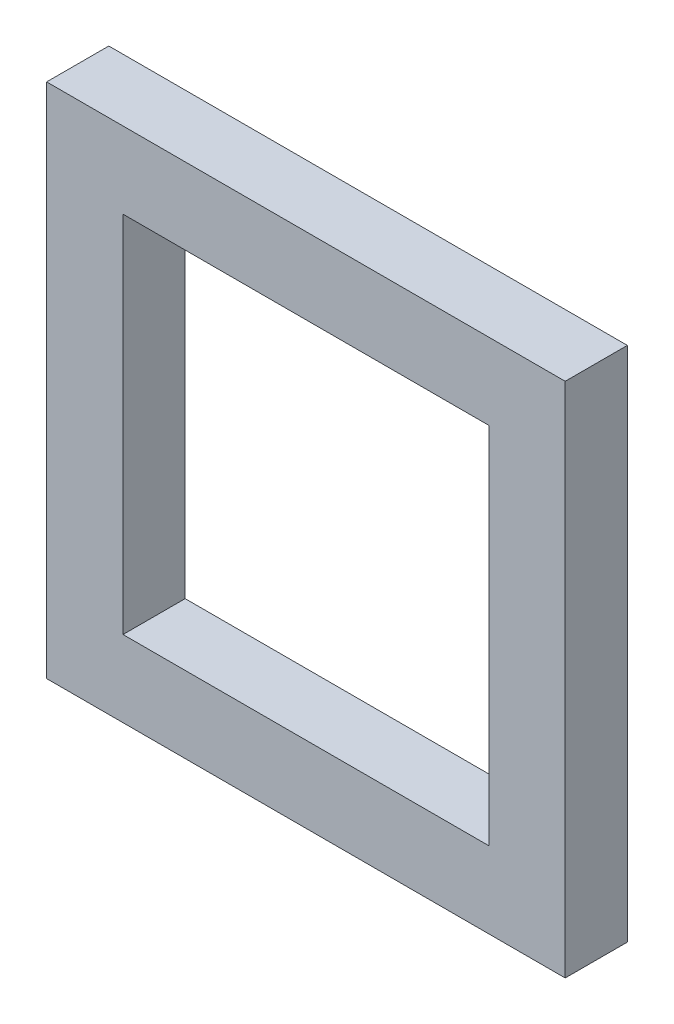
ISO-10303-21;
HEADER;
FILE_DESCRIPTION(('STEP AP214'),'2;1');
FILE_NAME('part.step','',(''),(''),'','','');
FILE_SCHEMA(('AUTOMOTIVE_DESIGN { 1 0 10303 214 1 1 1 1 }'));
ENDSEC;
DATA;
#1=APPLICATION_CONTEXT('core data for automotive mechanical design processes');
#2=APPLICATION_PROTOCOL_DEFINITION('international standard','automotive_design',2000,#1);
#3=PRODUCT_CONTEXT('',#1,'mechanical');
#4=PRODUCT('Part','Part','',(#3));
#5=PRODUCT_RELATED_PRODUCT_CATEGORY('part','',(#4));
#6=PRODUCT_DEFINITION_FORMATION('','',#4);
#7=PRODUCT_DEFINITION_CONTEXT('part definition',#1,'design');
#8=PRODUCT_DEFINITION('design','',#6,#7);
#9=PRODUCT_DEFINITION_SHAPE('','',#8);
#10=(LENGTH_UNIT() NAMED_UNIT(*) SI_UNIT(.MILLI.,.METRE.));
#11=(NAMED_UNIT(*) PLANE_ANGLE_UNIT() SI_UNIT($,.RADIAN.));
#12=(NAMED_UNIT(*) SI_UNIT($,.STERADIAN.) SOLID_ANGLE_UNIT());
#13=UNCERTAINTY_MEASURE_WITH_UNIT(LENGTH_MEASURE(1.E-05),#10,'distance_accuracy_value','');
#14=(GEOMETRIC_REPRESENTATION_CONTEXT(3) GLOBAL_UNCERTAINTY_ASSIGNED_CONTEXT((#13)) GLOBAL_UNIT_ASSIGNED_CONTEXT((#10,
#11,#12)) REPRESENTATION_CONTEXT('',''));
#15=CARTESIAN_POINT('',(0.,0.,0.));
#16=DIRECTION('',(0.,0.,1.));
#17=DIRECTION('',(1.,0.,0.));
#18=AXIS2_PLACEMENT_3D('',#15,#16,#17);
#19=CARTESIAN_POINT('',(0.,0.,6.35));
#20=DIRECTION('',(0.,0.,1.));
#21=DIRECTION('',(1.,0.,0.));
#22=AXIS2_PLACEMENT_3D('',#19,#20,#21);
#23=PLANE('',#22);
#24=DIRECTION('',(0.,1.,0.));
#25=VECTOR('',#24,1.);
#26=CARTESIAN_POINT('',(0.,0.,6.35));
#27=LINE('',#26,#25);
#28=CARTESIAN_POINT('',(0.,0.,6.35));
#29=VERTEX_POINT('',#28);
#30=CARTESIAN_POINT('',(0.,63.754,6.35));
#31=VERTEX_POINT('',#30);
#32=EDGE_CURVE('E298',#29,#31,#27,.T.);
#33=ORIENTED_EDGE('',*,*,#32,.T.);
#34=DIRECTION('',(1.,0.,0.));
#35=VECTOR('',#34,1.);
#36=CARTESIAN_POINT('',(2.67948056904725E-13,63.7540000000003,6.35));
#37=LINE('',#36,#35);
#38=CARTESIAN_POINT('',(64.008,63.754,6.35));
#39=VERTEX_POINT('',#38);
#40=EDGE_CURVE('E288',#31,#39,#37,.T.);
#41=ORIENTED_EDGE('',*,*,#40,.T.);
#42=DIRECTION('',(0.,-1.,0.));
#43=VECTOR('',#42,1.);
#44=CARTESIAN_POINT('',(64.008,0.,6.35));
#45=LINE('',#44,#43);
#46=CARTESIAN_POINT('',(64.008,0.,6.35));
#47=VERTEX_POINT('',#46);
#48=EDGE_CURVE('E291',#39,#47,#45,.T.);
#49=ORIENTED_EDGE('',*,*,#48,.T.);
#50=DIRECTION('',(1.,0.,0.));
#51=VECTOR('',#50,1.);
#52=CARTESIAN_POINT('',(0.,0.,6.35));
#53=LINE('',#52,#51);
#54=EDGE_CURVE('E295',#29,#47,#53,.T.);
#55=ORIENTED_EDGE('',*,*,#54,.F.);
#56=EDGE_LOOP('',(#33,#41,#49,#55));
#57=FACE_BOUND('',#56,.T.);
#58=DIRECTION('',(1.,0.,0.));
#59=VECTOR('',#58,1.);
#60=CARTESIAN_POINT('',(0.,3.302,6.35));
#61=LINE('',#60,#59);
#62=CARTESIAN_POINT('',(3.30200000000001,3.302,6.35));
#63=VERTEX_POINT('',#62);
#64=CARTESIAN_POINT('',(60.706,3.302,6.35));
#65=VERTEX_POINT('',#64);
#66=EDGE_CURVE('E131',#63,#65,#61,.T.);
#67=ORIENTED_EDGE('',*,*,#66,.T.);
#68=DIRECTION('',(0.,1.,0.));
#69=VECTOR('',#68,1.);
#70=CARTESIAN_POINT('',(60.706,0.,6.35));
#71=LINE('',#70,#69);
#72=CARTESIAN_POINT('',(60.706,60.452,6.35));
#73=VERTEX_POINT('',#72);
#74=EDGE_CURVE('E135',#65,#73,#71,.T.);
#75=ORIENTED_EDGE('',*,*,#74,.T.);
#76=DIRECTION('',(1.,0.,0.));
#77=VECTOR('',#76,1.);
#78=CARTESIAN_POINT('',(0.,60.452,6.35));
#79=LINE('',#78,#77);
#80=CARTESIAN_POINT('',(3.302,60.452,6.35));
#81=VERTEX_POINT('',#80);
#82=EDGE_CURVE('E657',#81,#73,#79,.T.);
#83=ORIENTED_EDGE('',*,*,#82,.F.);
#84=DIRECTION('',(0.,-1.,0.));
#85=VECTOR('',#84,1.);
#86=CARTESIAN_POINT('',(3.30200000000001,0.,6.35));
#87=LINE('',#86,#85);
#88=EDGE_CURVE('E644',#81,#63,#87,.T.);
#89=ORIENTED_EDGE('',*,*,#88,.T.);
#90=EDGE_LOOP('',(#67,#75,#83,#89));
#91=FACE_BOUND('',#90,.T.);
#92=ADVANCED_FACE('F114',(#57,#91),#23,.F.);
#93=CARTESIAN_POINT('',(2.67948056904725E-13,63.7540000000003,6.35));
#94=DIRECTION('',(0.,1.,0.));
#95=DIRECTION('',(-1.,0.,0.));
#96=AXIS2_PLACEMENT_3D('',#93,#94,#95);
#97=PLANE('',#96);
#98=DIRECTION('',(1.,0.,0.));
#99=VECTOR('',#98,1.);
#100=CARTESIAN_POINT('',(2.67948056904725E-13,63.7540000000003,0.));
#101=LINE('',#100,#99);
#102=CARTESIAN_POINT('',(0.,63.754,0.));
#103=VERTEX_POINT('',#102);
#104=CARTESIAN_POINT('',(64.008,63.754,0.));
#105=VERTEX_POINT('',#104);
#106=EDGE_CURVE('E312',#103,#105,#101,.T.);
#107=ORIENTED_EDGE('',*,*,#106,.T.);
#108=DIRECTION('',(0.,0.,-1.));
#109=VECTOR('',#108,1.);
#110=CARTESIAN_POINT('',(64.008,63.754,6.35));
#111=LINE('',#110,#109);
#112=EDGE_CURVE('E12',#39,#105,#111,.T.);
#113=ORIENTED_EDGE('',*,*,#112,.F.);
#114=ORIENTED_EDGE('',*,*,#40,.F.);
#115=DIRECTION('',(0.,0.,-1.));
#116=VECTOR('',#115,1.);
#117=CARTESIAN_POINT('',(0.,63.754,6.35));
#118=LINE('',#117,#116);
#119=EDGE_CURVE('E322',#31,#103,#118,.T.);
#120=ORIENTED_EDGE('',*,*,#119,.T.);
#121=EDGE_LOOP('',(#107,#113,#114,#120));
#122=FACE_BOUND('',#121,.T.);
#123=ADVANCED_FACE('F370',(#122),#97,.F.);
#124=CARTESIAN_POINT('',(64.008,0.,6.35));
#125=DIRECTION('',(1.,0.,0.));
#126=DIRECTION('',(0.,0.,-1.));
#127=AXIS2_PLACEMENT_3D('',#124,#125,#126);
#128=PLANE('',#127);
#129=DIRECTION('',(0.,-1.,0.));
#130=VECTOR('',#129,1.);
#131=CARTESIAN_POINT('',(64.008,0.,0.));
#132=LINE('',#131,#130);
#133=CARTESIAN_POINT('',(64.008,0.,0.));
#134=VERTEX_POINT('',#133);
#135=EDGE_CURVE('E315',#105,#134,#132,.T.);
#136=ORIENTED_EDGE('',*,*,#135,.T.);
#137=DIRECTION('',(0.,0.,-1.));
#138=VECTOR('',#137,1.);
#139=CARTESIAN_POINT('',(64.008,0.,6.35));
#140=LINE('',#139,#138);
#141=EDGE_CURVE('E123',#47,#134,#140,.T.);
#142=ORIENTED_EDGE('',*,*,#141,.F.);
#143=ORIENTED_EDGE('',*,*,#48,.F.);
#144=ORIENTED_EDGE('',*,*,#112,.T.);
#145=EDGE_LOOP('',(#136,#142,#143,#144));
#146=FACE_BOUND('',#145,.T.);
#147=ADVANCED_FACE('F376',(#146),#128,.F.);
#148=CARTESIAN_POINT('',(0.,0.,6.35));
#149=DIRECTION('',(0.,1.,0.));
#150=DIRECTION('',(-1.,0.,0.));
#151=AXIS2_PLACEMENT_3D('',#148,#149,#150);
#152=PLANE('',#151);
#153=DIRECTION('',(1.,0.,0.));
#154=VECTOR('',#153,1.);
#155=CARTESIAN_POINT('',(0.,0.,0.));
#156=LINE('',#155,#154);
#157=CARTESIAN_POINT('',(0.,0.,0.));
#158=VERTEX_POINT('',#157);
#159=EDGE_CURVE('E318',#158,#134,#156,.T.);
#160=ORIENTED_EDGE('',*,*,#159,.F.);
#161=DIRECTION('',(0.,0.,-1.));
#162=VECTOR('',#161,1.);
#163=CARTESIAN_POINT('',(0.,0.,6.35));
#164=LINE('',#163,#162);
#165=EDGE_CURVE('E325',#29,#158,#164,.T.);
#166=ORIENTED_EDGE('',*,*,#165,.F.);
#167=ORIENTED_EDGE('',*,*,#54,.T.);
#168=ORIENTED_EDGE('',*,*,#141,.T.);
#169=EDGE_LOOP('',(#160,#166,#167,#168));
#170=FACE_BOUND('',#169,.T.);
#171=ADVANCED_FACE('F539',(#170),#152,.T.);
#172=CARTESIAN_POINT('',(69.088,0.,6.35));
#173=DIRECTION('',(1.,0.,0.));
#174=DIRECTION('',(0.,1.,0.));
#175=AXIS2_PLACEMENT_3D('',#172,#173,#174);
#176=PLANE('',#175);
#177=DIRECTION('',(0.,-1.,0.));
#178=VECTOR('',#177,1.);
#179=CARTESIAN_POINT('',(69.088,0.,0.));
#180=LINE('',#179,#178);
#181=CARTESIAN_POINT('',(69.088,68.834,0.));
#182=VERTEX_POINT('',#181);
#183=CARTESIAN_POINT('',(69.088,-5.08,0.));
#184=VERTEX_POINT('',#183);
#185=EDGE_CURVE('E287',#182,#184,#180,.T.);
#186=ORIENTED_EDGE('',*,*,#185,.F.);
#187=DIRECTION('',(0.,0.,-1.));
#188=VECTOR('',#187,1.);
#189=CARTESIAN_POINT('',(69.088,68.834,6.35));
#190=LINE('',#189,#188);
#191=CARTESIAN_POINT('',(69.088,68.834,8.89));
#192=VERTEX_POINT('',#191);
#193=EDGE_CURVE('E118',#192,#182,#190,.T.);
#194=ORIENTED_EDGE('',*,*,#193,.F.);
#195=DIRECTION('',(0.,1.,0.));
#196=VECTOR('',#195,1.);
#197=CARTESIAN_POINT('',(69.088,0.,8.89));
#198=LINE('',#197,#196);
#199=CARTESIAN_POINT('',(69.088,-5.08,8.89));
#200=VERTEX_POINT('',#199);
#201=EDGE_CURVE('E266',#200,#192,#198,.T.);
#202=ORIENTED_EDGE('',*,*,#201,.F.);
#203=DIRECTION('',(0.,0.,-1.));
#204=VECTOR('',#203,1.);
#205=CARTESIAN_POINT('',(69.088,-5.08,6.35));
#206=LINE('',#205,#204);
#207=EDGE_CURVE('E301',#200,#184,#206,.T.);
#208=ORIENTED_EDGE('',*,*,#207,.T.);
#209=EDGE_LOOP('',(#186,#194,#202,#208));
#210=FACE_BOUND('',#209,.T.);
#211=ADVANCED_FACE('F116',(#210),#176,.T.);
#212=CARTESIAN_POINT('',(0.,68.834,6.35));
#213=DIRECTION('',(0.,1.,0.));
#214=DIRECTION('',(0.,0.,1.));
#215=AXIS2_PLACEMENT_3D('',#212,#213,#214);
#216=PLANE('',#215);
#217=DIRECTION('',(1.,0.,0.));
#218=VECTOR('',#217,1.);
#219=CARTESIAN_POINT('',(0.,68.834,0.));
#220=LINE('',#219,#218);
#221=CARTESIAN_POINT('',(-5.08,68.834,0.));
#222=VERTEX_POINT('',#221);
#223=EDGE_CURVE('E304',#222,#182,#220,.T.);
#224=ORIENTED_EDGE('',*,*,#223,.F.);
#225=DIRECTION('',(0.,0.,-1.));
#226=VECTOR('',#225,1.);
#227=CARTESIAN_POINT('',(-5.08,68.834,6.35));
#228=LINE('',#227,#226);
#229=CARTESIAN_POINT('',(-5.08,68.834,8.89));
#230=VERTEX_POINT('',#229);
#231=EDGE_CURVE('E331',#230,#222,#228,.T.);
#232=ORIENTED_EDGE('',*,*,#231,.F.);
#233=DIRECTION('',(-1.,0.,0.));
#234=VECTOR('',#233,1.);
#235=CARTESIAN_POINT('',(0.,68.834,8.89));
#236=LINE('',#235,#234);
#237=EDGE_CURVE('E269',#192,#230,#236,.T.);
#238=ORIENTED_EDGE('',*,*,#237,.F.);
#239=ORIENTED_EDGE('',*,*,#193,.T.);
#240=EDGE_LOOP('',(#224,#232,#238,#239));
#241=FACE_BOUND('',#240,.T.);
#242=ADVANCED_FACE('F339',(#241),#216,.T.);
#243=CARTESIAN_POINT('',(-5.07999999999999,0.,6.35));
#244=DIRECTION('',(1.,0.,0.));
#245=DIRECTION('',(0.,1.,0.));
#246=AXIS2_PLACEMENT_3D('',#243,#244,#245);
#247=PLANE('',#246);
#248=DIRECTION('',(0.,-1.,0.));
#249=VECTOR('',#248,1.);
#250=CARTESIAN_POINT('',(-5.07999999999999,0.,0.));
#251=LINE('',#250,#249);
#252=CARTESIAN_POINT('',(-5.07999999999999,-5.08,0.));
#253=VERTEX_POINT('',#252);
#254=EDGE_CURVE('E307',#222,#253,#251,.T.);
#255=ORIENTED_EDGE('',*,*,#254,.T.);
#256=DIRECTION('',(0.,0.,-1.));
#257=VECTOR('',#256,1.);
#258=CARTESIAN_POINT('',(-5.07999999999999,-5.08,6.35));
#259=LINE('',#258,#257);
#260=CARTESIAN_POINT('',(-5.07999999999999,-5.08,8.89));
#261=VERTEX_POINT('',#260);
#262=EDGE_CURVE('E329',#261,#253,#259,.T.);
#263=ORIENTED_EDGE('',*,*,#262,.F.);
#264=DIRECTION('',(0.,-1.,0.));
#265=VECTOR('',#264,1.);
#266=CARTESIAN_POINT('',(-5.07999999999999,0.,8.89));
#267=LINE('',#266,#265);
#268=EDGE_CURVE('E272',#230,#261,#267,.T.);
#269=ORIENTED_EDGE('',*,*,#268,.F.);
#270=ORIENTED_EDGE('',*,*,#231,.T.);
#271=EDGE_LOOP('',(#255,#263,#269,#270));
#272=FACE_BOUND('',#271,.T.);
#273=ADVANCED_FACE('F346',(#272),#247,.F.);
#274=CARTESIAN_POINT('',(0.,-5.08,6.35));
#275=DIRECTION('',(0.,1.,0.));
#276=DIRECTION('',(0.,0.,1.));
#277=AXIS2_PLACEMENT_3D('',#274,#275,#276);
#278=PLANE('',#277);
#279=DIRECTION('',(1.,0.,0.));
#280=VECTOR('',#279,1.);
#281=CARTESIAN_POINT('',(0.,-5.08,0.));
#282=LINE('',#281,#280);
#283=EDGE_CURVE('E309',#253,#184,#282,.T.);
#284=ORIENTED_EDGE('',*,*,#283,.T.);
#285=ORIENTED_EDGE('',*,*,#207,.F.);
#286=DIRECTION('',(1.,0.,0.));
#287=VECTOR('',#286,1.);
#288=CARTESIAN_POINT('',(0.,-5.08,8.89));
#289=LINE('',#288,#287);
#290=EDGE_CURVE('E248',#261,#200,#289,.T.);
#291=ORIENTED_EDGE('',*,*,#290,.F.);
#292=ORIENTED_EDGE('',*,*,#262,.T.);
#293=EDGE_LOOP('',(#284,#285,#291,#292));
#294=FACE_BOUND('',#293,.T.);
#295=ADVANCED_FACE('F349',(#294),#278,.F.);
#296=CARTESIAN_POINT('',(0.,0.,6.35));
#297=DIRECTION('',(-1.,0.,0.));
#298=DIRECTION('',(0.,0.,1.));
#299=AXIS2_PLACEMENT_3D('',#296,#297,#298);
#300=PLANE('',#299);
#301=DIRECTION('',(0.,1.,0.));
#302=VECTOR('',#301,1.);
#303=CARTESIAN_POINT('',(0.,0.,0.));
#304=LINE('',#303,#302);
#305=EDGE_CURVE('E292',#158,#103,#304,.T.);
#306=ORIENTED_EDGE('',*,*,#305,.T.);
#307=ORIENTED_EDGE('',*,*,#119,.F.);
#308=ORIENTED_EDGE('',*,*,#32,.F.);
#309=ORIENTED_EDGE('',*,*,#165,.T.);
#310=EDGE_LOOP('',(#306,#307,#308,#309));
#311=FACE_BOUND('',#310,.T.);
#312=ADVANCED_FACE('F491',(#311),#300,.F.);
#313=CARTESIAN_POINT('',(0.,0.,0.));
#314=DIRECTION('',(0.,0.,1.));
#315=DIRECTION('',(1.,0.,0.));
#316=AXIS2_PLACEMENT_3D('',#313,#314,#315);
#317=PLANE('',#316);
#318=ORIENTED_EDGE('',*,*,#185,.T.);
#319=ORIENTED_EDGE('',*,*,#283,.F.);
#320=ORIENTED_EDGE('',*,*,#254,.F.);
#321=ORIENTED_EDGE('',*,*,#223,.T.);
#322=EDGE_LOOP('',(#318,#319,#320,#321));
#323=FACE_BOUND('',#322,.T.);
#324=ORIENTED_EDGE('',*,*,#106,.F.);
#325=ORIENTED_EDGE('',*,*,#305,.F.);
#326=ORIENTED_EDGE('',*,*,#159,.T.);
#327=ORIENTED_EDGE('',*,*,#135,.F.);
#328=EDGE_LOOP('',(#324,#325,#326,#327));
#329=FACE_BOUND('',#328,.T.);
#330=ADVANCED_FACE('F344',(#323,#329),#317,.F.);
#331=CARTESIAN_POINT('',(0.,57.912,8.89));
#332=DIRECTION('',(0.,1.,0.));
#333=DIRECTION('',(0.,0.,1.));
#334=AXIS2_PLACEMENT_3D('',#331,#332,#333);
#335=PLANE('',#334);
#336=DIRECTION('',(0.,0.,-1.));
#337=VECTOR('',#336,1.);
#338=CARTESIAN_POINT('',(5.842,57.912,8.89));
#339=LINE('',#338,#337);
#340=CARTESIAN_POINT('',(5.842,57.912,8.89));
#341=VERTEX_POINT('',#340);
#342=CARTESIAN_POINT('',(5.842,57.912,0.));
#343=VERTEX_POINT('',#342);
#344=EDGE_CURVE('E239',#341,#343,#339,.T.);
#345=ORIENTED_EDGE('',*,*,#344,.T.);
#346=DIRECTION('',(1.,0.,0.));
#347=VECTOR('',#346,1.);
#348=CARTESIAN_POINT('',(5.842,57.912,0.));
#349=LINE('',#348,#347);
#350=CARTESIAN_POINT('',(58.166,57.912,0.));
#351=VERTEX_POINT('',#350);
#352=EDGE_CURVE('E253',#343,#351,#349,.T.);
#353=ORIENTED_EDGE('',*,*,#352,.T.);
#354=DIRECTION('',(0.,0.,-1.));
#355=VECTOR('',#354,1.);
#356=CARTESIAN_POINT('',(58.166,57.912,8.89));
#357=LINE('',#356,#355);
#358=CARTESIAN_POINT('',(58.166,57.912,8.89));
#359=VERTEX_POINT('',#358);
#360=EDGE_CURVE('E285',#359,#351,#357,.T.);
#361=ORIENTED_EDGE('',*,*,#360,.F.);
#362=DIRECTION('',(1.,0.,0.));
#363=VECTOR('',#362,1.);
#364=CARTESIAN_POINT('',(0.,57.912,8.89));
#365=LINE('',#364,#363);
#366=EDGE_CURVE('E275',#341,#359,#365,.T.);
#367=ORIENTED_EDGE('',*,*,#366,.F.);
#368=EDGE_LOOP('',(#345,#353,#361,#367));
#369=FACE_BOUND('',#368,.T.);
#370=ADVANCED_FACE('F358',(#369),#335,.F.);
#371=CARTESIAN_POINT('',(58.166,0.,8.89));
#372=DIRECTION('',(1.,0.,0.));
#373=DIRECTION('',(0.,0.,-1.));
#374=AXIS2_PLACEMENT_3D('',#371,#372,#373);
#375=PLANE('',#374);
#376=ORIENTED_EDGE('',*,*,#360,.T.);
#377=DIRECTION('',(0.,-1.,0.));
#378=VECTOR('',#377,1.);
#379=CARTESIAN_POINT('',(58.166,57.912,0.));
#380=LINE('',#379,#378);
#381=CARTESIAN_POINT('',(58.166,5.842,0.));
#382=VERTEX_POINT('',#381);
#383=EDGE_CURVE('E249',#351,#382,#380,.T.);
#384=ORIENTED_EDGE('',*,*,#383,.T.);
#385=DIRECTION('',(0.,0.,-1.));
#386=VECTOR('',#385,1.);
#387=CARTESIAN_POINT('',(58.166,5.842,8.89));
#388=LINE('',#387,#386);
#389=CARTESIAN_POINT('',(58.166,5.842,8.89));
#390=VERTEX_POINT('',#389);
#391=EDGE_CURVE('E238',#390,#382,#388,.T.);
#392=ORIENTED_EDGE('',*,*,#391,.F.);
#393=DIRECTION('',(0.,-1.,0.));
#394=VECTOR('',#393,1.);
#395=CARTESIAN_POINT('',(58.166,0.,8.89));
#396=LINE('',#395,#394);
#397=EDGE_CURVE('E278',#359,#390,#396,.T.);
#398=ORIENTED_EDGE('',*,*,#397,.F.);
#399=EDGE_LOOP('',(#376,#384,#392,#398));
#400=FACE_BOUND('',#399,.T.);
#401=ADVANCED_FACE('F360',(#400),#375,.F.);
#402=CARTESIAN_POINT('',(0.,5.842,8.89));
#403=DIRECTION('',(0.,1.,0.));
#404=DIRECTION('',(0.,0.,1.));
#405=AXIS2_PLACEMENT_3D('',#402,#403,#404);
#406=PLANE('',#405);
#407=ORIENTED_EDGE('',*,*,#391,.T.);
#408=DIRECTION('',(1.,0.,0.));
#409=VECTOR('',#408,1.);
#410=CARTESIAN_POINT('',(5.84200000000001,5.842,0.));
#411=LINE('',#410,#409);
#412=CARTESIAN_POINT('',(5.84200000000001,5.842,0.));
#413=VERTEX_POINT('',#412);
#414=EDGE_CURVE('E242',#413,#382,#411,.T.);
#415=ORIENTED_EDGE('',*,*,#414,.F.);
#416=DIRECTION('',(0.,0.,-1.));
#417=VECTOR('',#416,1.);
#418=CARTESIAN_POINT('',(5.842,5.842,8.89));
#419=LINE('',#418,#417);
#420=CARTESIAN_POINT('',(5.842,5.842,8.89));
#421=VERTEX_POINT('',#420);
#422=EDGE_CURVE('E227',#421,#413,#419,.T.);
#423=ORIENTED_EDGE('',*,*,#422,.F.);
#424=DIRECTION('',(1.,0.,0.));
#425=VECTOR('',#424,1.);
#426=CARTESIAN_POINT('',(0.,5.842,8.89));
#427=LINE('',#426,#425);
#428=EDGE_CURVE('E280',#421,#390,#427,.T.);
#429=ORIENTED_EDGE('',*,*,#428,.T.);
#430=EDGE_LOOP('',(#407,#415,#423,#429));
#431=FACE_BOUND('',#430,.T.);
#432=ADVANCED_FACE('F243',(#431),#406,.T.);
#433=CARTESIAN_POINT('',(5.842,0.,8.89));
#434=DIRECTION('',(1.,0.,0.));
#435=DIRECTION('',(0.,0.,-1.));
#436=AXIS2_PLACEMENT_3D('',#433,#434,#435);
#437=PLANE('',#436);
#438=ORIENTED_EDGE('',*,*,#422,.T.);
#439=DIRECTION('',(0.,-1.,0.));
#440=VECTOR('',#439,1.);
#441=CARTESIAN_POINT('',(5.842,57.912,0.));
#442=LINE('',#441,#440);
#443=EDGE_CURVE('E231',#343,#413,#442,.T.);
#444=ORIENTED_EDGE('',*,*,#443,.F.);
#445=ORIENTED_EDGE('',*,*,#344,.F.);
#446=DIRECTION('',(0.,-1.,0.));
#447=VECTOR('',#446,1.);
#448=CARTESIAN_POINT('',(5.842,0.,8.89));
#449=LINE('',#448,#447);
#450=EDGE_CURVE('E234',#341,#421,#449,.T.);
#451=ORIENTED_EDGE('',*,*,#450,.T.);
#452=EDGE_LOOP('',(#438,#444,#445,#451));
#453=FACE_BOUND('',#452,.T.);
#454=ADVANCED_FACE('F229',(#453),#437,.T.);
#455=CARTESIAN_POINT('',(0.,0.,8.89));
#456=DIRECTION('',(0.,0.,1.));
#457=DIRECTION('',(1.,0.,0.));
#458=AXIS2_PLACEMENT_3D('',#455,#456,#457);
#459=PLANE('',#458);
#460=ORIENTED_EDGE('',*,*,#290,.T.);
#461=ORIENTED_EDGE('',*,*,#201,.T.);
#462=ORIENTED_EDGE('',*,*,#237,.T.);
#463=ORIENTED_EDGE('',*,*,#268,.T.);
#464=EDGE_LOOP('',(#460,#461,#462,#463));
#465=FACE_BOUND('',#464,.T.);
#466=ORIENTED_EDGE('',*,*,#366,.T.);
#467=ORIENTED_EDGE('',*,*,#397,.T.);
#468=ORIENTED_EDGE('',*,*,#428,.F.);
#469=ORIENTED_EDGE('',*,*,#450,.F.);
#470=EDGE_LOOP('',(#466,#467,#468,#469));
#471=FACE_BOUND('',#470,.T.);
#472=ADVANCED_FACE('F351',(#465,#471),#459,.T.);
#473=CARTESIAN_POINT('',(0.,0.,0.));
#474=DIRECTION('',(0.,0.,1.));
#475=DIRECTION('',(1.,0.,0.));
#476=AXIS2_PLACEMENT_3D('',#473,#474,#475);
#477=PLANE('',#476);
#478=DIRECTION('',(1.,0.,0.));
#479=VECTOR('',#478,1.);
#480=CARTESIAN_POINT('',(0.,3.302,0.));
#481=LINE('',#480,#479);
#482=CARTESIAN_POINT('',(3.30200000000001,3.302,0.));
#483=VERTEX_POINT('',#482);
#484=CARTESIAN_POINT('',(60.706,3.302,0.));
#485=VERTEX_POINT('',#484);
#486=EDGE_CURVE('E254',#483,#485,#481,.T.);
#487=ORIENTED_EDGE('',*,*,#486,.F.);
#488=DIRECTION('',(0.,-1.,0.));
#489=VECTOR('',#488,1.);
#490=CARTESIAN_POINT('',(3.30200000000001,0.,0.));
#491=LINE('',#490,#489);
#492=CARTESIAN_POINT('',(3.302,60.452,0.));
#493=VERTEX_POINT('',#492);
#494=EDGE_CURVE('E632',#493,#483,#491,.T.);
#495=ORIENTED_EDGE('',*,*,#494,.F.);
#496=DIRECTION('',(1.,0.,0.));
#497=VECTOR('',#496,1.);
#498=CARTESIAN_POINT('',(0.,60.452,0.));
#499=LINE('',#498,#497);
#500=CARTESIAN_POINT('',(60.706,60.452,0.));
#501=VERTEX_POINT('',#500);
#502=EDGE_CURVE('E641',#493,#501,#499,.T.);
#503=ORIENTED_EDGE('',*,*,#502,.T.);
#504=DIRECTION('',(0.,1.,0.));
#505=VECTOR('',#504,1.);
#506=CARTESIAN_POINT('',(60.706,0.,0.));
#507=LINE('',#506,#505);
#508=EDGE_CURVE('E258',#485,#501,#507,.T.);
#509=ORIENTED_EDGE('',*,*,#508,.F.);
#510=EDGE_LOOP('',(#487,#495,#503,#509));
#511=FACE_BOUND('',#510,.T.);
#512=ORIENTED_EDGE('',*,*,#414,.T.);
#513=ORIENTED_EDGE('',*,*,#383,.F.);
#514=ORIENTED_EDGE('',*,*,#352,.F.);
#515=ORIENTED_EDGE('',*,*,#443,.T.);
#516=EDGE_LOOP('',(#512,#513,#514,#515));
#517=FACE_BOUND('',#516,.T.);
#518=ADVANCED_FACE('F251',(#511,#517),#477,.F.);
#519=CARTESIAN_POINT('',(0.,3.302,6.35));
#520=DIRECTION('',(0.,1.,0.));
#521=DIRECTION('',(0.,0.,1.));
#522=AXIS2_PLACEMENT_3D('',#519,#520,#521);
#523=PLANE('',#522);
#524=ORIENTED_EDGE('',*,*,#486,.T.);
#525=DIRECTION('',(0.,0.,-1.));
#526=VECTOR('',#525,1.);
#527=CARTESIAN_POINT('',(60.706,3.302,6.35));
#528=LINE('',#527,#526);
#529=EDGE_CURVE('E649',#65,#485,#528,.T.);
#530=ORIENTED_EDGE('',*,*,#529,.F.);
#531=ORIENTED_EDGE('',*,*,#66,.F.);
#532=DIRECTION('',(0.,0.,-1.));
#533=VECTOR('',#532,1.);
#534=CARTESIAN_POINT('',(3.30200000000001,3.302,6.35));
#535=LINE('',#534,#533);
#536=EDGE_CURVE('E635',#63,#483,#535,.T.);
#537=ORIENTED_EDGE('',*,*,#536,.T.);
#538=EDGE_LOOP('',(#524,#530,#531,#537));
#539=FACE_BOUND('',#538,.T.);
#540=ADVANCED_FACE('F396',(#539),#523,.F.);
#541=CARTESIAN_POINT('',(60.706,0.,6.35));
#542=DIRECTION('',(-1.,0.,0.));
#543=DIRECTION('',(0.,-1.,0.));
#544=AXIS2_PLACEMENT_3D('',#541,#542,#543);
#545=PLANE('',#544);
#546=ORIENTED_EDGE('',*,*,#508,.T.);
#547=DIRECTION('',(0.,0.,-1.));
#548=VECTOR('',#547,1.);
#549=CARTESIAN_POINT('',(60.706,60.452,6.35));
#550=LINE('',#549,#548);
#551=EDGE_CURVE('E650',#73,#501,#550,.T.);
#552=ORIENTED_EDGE('',*,*,#551,.F.);
#553=ORIENTED_EDGE('',*,*,#74,.F.);
#554=ORIENTED_EDGE('',*,*,#529,.T.);
#555=EDGE_LOOP('',(#546,#552,#553,#554));
#556=FACE_BOUND('',#555,.T.);
#557=ADVANCED_FACE('F403',(#556),#545,.F.);
#558=CARTESIAN_POINT('',(0.,60.452,6.35));
#559=DIRECTION('',(0.,1.,0.));
#560=DIRECTION('',(0.,0.,1.));
#561=AXIS2_PLACEMENT_3D('',#558,#559,#560);
#562=PLANE('',#561);
#563=ORIENTED_EDGE('',*,*,#502,.F.);
#564=DIRECTION('',(0.,0.,-1.));
#565=VECTOR('',#564,1.);
#566=CARTESIAN_POINT('',(3.302,60.452,6.35));
#567=LINE('',#566,#565);
#568=EDGE_CURVE('E637',#81,#493,#567,.T.);
#569=ORIENTED_EDGE('',*,*,#568,.F.);
#570=ORIENTED_EDGE('',*,*,#82,.T.);
#571=ORIENTED_EDGE('',*,*,#551,.T.);
#572=EDGE_LOOP('',(#563,#569,#570,#571));
#573=FACE_BOUND('',#572,.T.);
#574=ADVANCED_FACE('F411',(#573),#562,.T.);
#575=CARTESIAN_POINT('',(3.30200000000001,0.,6.35));
#576=DIRECTION('',(1.,0.,0.));
#577=DIRECTION('',(0.,1.,0.));
#578=AXIS2_PLACEMENT_3D('',#575,#576,#577);
#579=PLANE('',#578);
#580=ORIENTED_EDGE('',*,*,#494,.T.);
#581=ORIENTED_EDGE('',*,*,#536,.F.);
#582=ORIENTED_EDGE('',*,*,#88,.F.);
#583=ORIENTED_EDGE('',*,*,#568,.T.);
#584=EDGE_LOOP('',(#580,#581,#582,#583));
#585=FACE_BOUND('',#584,.T.);
#586=ADVANCED_FACE('F419',(#585),#579,.F.);
#587=CLOSED_SHELL('',(#92,#123,#147,#171,#211,#242,#273,#295,#312,#330,#370,#401,#432,#454,#472,
#518,#540,#557,#574,#586));
#588=MANIFOLD_SOLID_BREP('B2',#587);
#589=ADVANCED_BREP_SHAPE_REPRESENTATION('',(#18,#588),#14);
#590=SHAPE_DEFINITION_REPRESENTATION(#9,#589);
ENDSEC;
END-ISO-10303-21;
